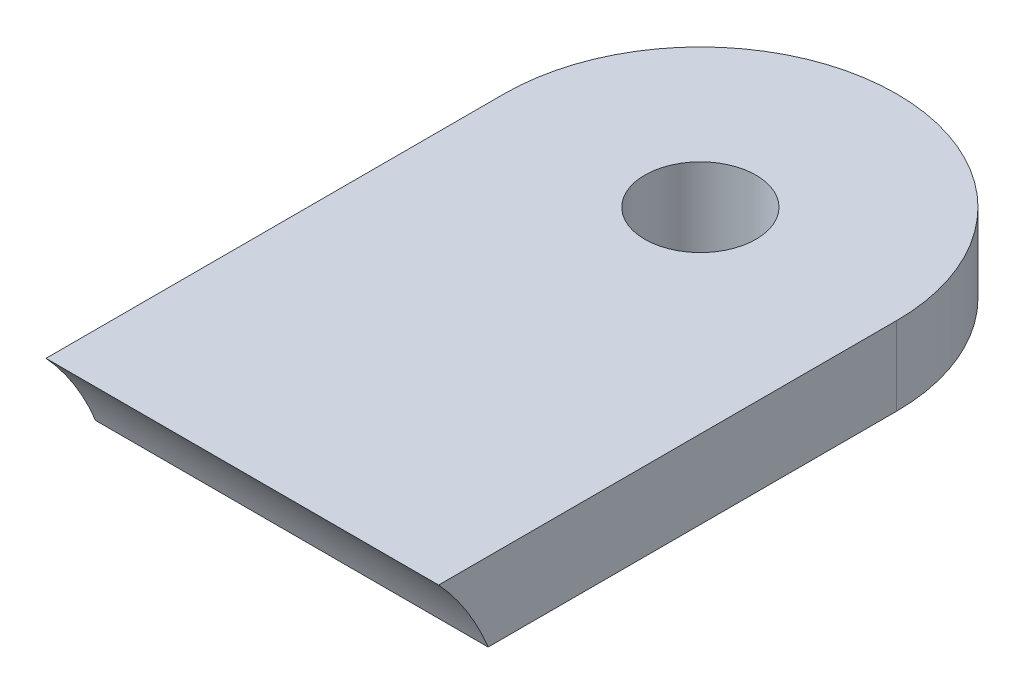
ISO-10303-21;
HEADER;
FILE_DESCRIPTION(('STEP AP214'),'2;1');
FILE_NAME('part.step','',(''),(''),'','','');
FILE_SCHEMA(('AUTOMOTIVE_DESIGN { 1 0 10303 214 1 1 1 1 }'));
ENDSEC;
DATA;
#1=APPLICATION_CONTEXT('core data for automotive mechanical design processes');
#2=APPLICATION_PROTOCOL_DEFINITION('international standard','automotive_design',2000,#1);
#3=PRODUCT_CONTEXT('',#1,'mechanical');
#4=PRODUCT('Part','Part','',(#3));
#5=PRODUCT_RELATED_PRODUCT_CATEGORY('part','',(#4));
#6=PRODUCT_DEFINITION_FORMATION('','',#4);
#7=PRODUCT_DEFINITION_CONTEXT('part definition',#1,'design');
#8=PRODUCT_DEFINITION('design','',#6,#7);
#9=PRODUCT_DEFINITION_SHAPE('','',#8);
#10=(LENGTH_UNIT() NAMED_UNIT(*) SI_UNIT(.MILLI.,.METRE.));
#11=(NAMED_UNIT(*) PLANE_ANGLE_UNIT() SI_UNIT($,.RADIAN.));
#12=(NAMED_UNIT(*) SI_UNIT($,.STERADIAN.) SOLID_ANGLE_UNIT());
#13=UNCERTAINTY_MEASURE_WITH_UNIT(LENGTH_MEASURE(1.E-05),#10,'distance_accuracy_value','');
#14=(GEOMETRIC_REPRESENTATION_CONTEXT(3) GLOBAL_UNCERTAINTY_ASSIGNED_CONTEXT((#13)) GLOBAL_UNIT_ASSIGNED_CONTEXT((#10,
#11,#12)) REPRESENTATION_CONTEXT('',''));
#15=CARTESIAN_POINT('',(0.,0.,0.));
#16=DIRECTION('',(0.,0.,1.));
#17=DIRECTION('',(1.,0.,0.));
#18=AXIS2_PLACEMENT_3D('',#15,#16,#17);
#19=CARTESIAN_POINT('',(0.,6.,0.));
#20=DIRECTION('',(0.,1.,0.));
#21=DIRECTION('',(0.,0.,1.));
#22=AXIS2_PLACEMENT_3D('',#19,#20,#21);
#23=PLANE('',#22);
#24=CARTESIAN_POINT('',(-15.,6.,-35.));
#25=DIRECTION('',(0.,1.,0.));
#26=DIRECTION('',(0.,0.,1.));
#27=AXIS2_PLACEMENT_3D('',#24,#25,#26);
#28=CIRCLE('',#27,15.);
#29=CARTESIAN_POINT('',(0.,6.,-35.));
#30=VERTEX_POINT('',#29);
#31=CARTESIAN_POINT('',(-15.,6.,-50.));
#32=VERTEX_POINT('',#31);
#33=EDGE_CURVE('E67',#30,#32,#28,.T.);
#34=ORIENTED_EDGE('',*,*,#33,.T.);
#35=CARTESIAN_POINT('',(-15.,6.,-35.));
#36=DIRECTION('',(0.,1.,0.));
#37=DIRECTION('',(0.,0.,1.));
#38=AXIS2_PLACEMENT_3D('',#35,#36,#37);
#39=CIRCLE('',#38,15.);
#40=CARTESIAN_POINT('',(-30.,6.,-35.));
#41=VERTEX_POINT('',#40);
#42=EDGE_CURVE('E60',#32,#41,#39,.T.);
#43=ORIENTED_EDGE('',*,*,#42,.T.);
#44=DIRECTION('',(0.,0.,1.));
#45=VECTOR('',#44,1.);
#46=CARTESIAN_POINT('',(-30.,6.,0.));
#47=LINE('',#46,#45);
#48=CARTESIAN_POINT('',(-30.,5.99999999999998,0.));
#49=VERTEX_POINT('',#48);
#50=EDGE_CURVE('E106',#41,#49,#47,.T.);
#51=ORIENTED_EDGE('',*,*,#50,.T.);
#52=DIRECTION('',(1.,0.,0.));
#53=VECTOR('',#52,1.);
#54=CARTESIAN_POINT('',(0.,6.,0.));
#55=LINE('',#54,#53);
#56=CARTESIAN_POINT('',(0.,6.,0.));
#57=VERTEX_POINT('',#56);
#58=EDGE_CURVE('E97',#49,#57,#55,.T.);
#59=ORIENTED_EDGE('',*,*,#58,.T.);
#60=DIRECTION('',(0.,0.,-1.));
#61=VECTOR('',#60,1.);
#62=CARTESIAN_POINT('',(0.,6.,0.));
#63=LINE('',#62,#61);
#64=EDGE_CURVE('E119',#57,#30,#63,.T.);
#65=ORIENTED_EDGE('',*,*,#64,.T.);
#66=EDGE_LOOP('',(#34,#43,#51,#59,#65));
#67=FACE_BOUND('',#66,.T.);
#68=CARTESIAN_POINT('',(-15.,6.,-35.));
#69=DIRECTION('',(0.,1.,0.));
#70=DIRECTION('',(0.,0.,1.));
#71=AXIS2_PLACEMENT_3D('',#68,#69,#70);
#72=CIRCLE('',#71,4.25);
#73=CARTESIAN_POINT('',(-15.,6.,-30.75));
#74=VERTEX_POINT('',#73);
#75=EDGE_CURVE('E126',#74,#74,#72,.T.);
#76=ORIENTED_EDGE('',*,*,#75,.F.);
#77=EDGE_LOOP('',(#76));
#78=FACE_BOUND('',#77,.T.);
#79=ADVANCED_FACE('F51',(#67,#78),#23,.T.);
#80=CARTESIAN_POINT('',(0.,0.,0.));
#81=DIRECTION('',(0.,1.,0.));
#82=DIRECTION('',(0.,0.,1.));
#83=AXIS2_PLACEMENT_3D('',#80,#81,#82);
#84=PLANE('',#83);
#85=DIRECTION('',(0.,0.,-1.));
#86=VECTOR('',#85,1.);
#87=CARTESIAN_POINT('',(0.,0.,0.));
#88=LINE('',#87,#86);
#89=CARTESIAN_POINT('',(0.,0.,-3.78414165436543));
#90=VERTEX_POINT('',#89);
#91=CARTESIAN_POINT('',(0.,0.,-35.));
#92=VERTEX_POINT('',#91);
#93=EDGE_CURVE('E124',#90,#92,#88,.T.);
#94=ORIENTED_EDGE('',*,*,#93,.F.);
#95=DIRECTION('',(-1.,0.,0.));
#96=VECTOR('',#95,1.);
#97=CARTESIAN_POINT('',(0.,0.,-3.78414165436543));
#98=LINE('',#97,#96);
#99=CARTESIAN_POINT('',(-30.,0.,-3.78414165436543));
#100=VERTEX_POINT('',#99);
#101=EDGE_CURVE('E145',#90,#100,#98,.T.);
#102=ORIENTED_EDGE('',*,*,#101,.T.);
#103=DIRECTION('',(0.,0.,1.));
#104=VECTOR('',#103,1.);
#105=CARTESIAN_POINT('',(-30.,0.,0.));
#106=LINE('',#105,#104);
#107=CARTESIAN_POINT('',(-30.,0.,-35.));
#108=VERTEX_POINT('',#107);
#109=EDGE_CURVE('E115',#108,#100,#106,.T.);
#110=ORIENTED_EDGE('',*,*,#109,.F.);
#111=CARTESIAN_POINT('',(-15.,0.,-35.));
#112=DIRECTION('',(0.,1.,0.));
#113=DIRECTION('',(0.,0.,1.));
#114=AXIS2_PLACEMENT_3D('',#111,#112,#113);
#115=CIRCLE('',#114,15.);
#116=CARTESIAN_POINT('',(-15.,0.,-50.));
#117=VERTEX_POINT('',#116);
#118=EDGE_CURVE('E132',#108,#117,#115,.F.);
#119=ORIENTED_EDGE('',*,*,#118,.T.);
#120=CARTESIAN_POINT('',(-15.,0.,-35.));
#121=DIRECTION('',(0.,1.,0.));
#122=DIRECTION('',(0.,0.,1.));
#123=AXIS2_PLACEMENT_3D('',#120,#121,#122);
#124=CIRCLE('',#123,15.);
#125=EDGE_CURVE('E129',#117,#92,#124,.F.);
#126=ORIENTED_EDGE('',*,*,#125,.T.);
#127=EDGE_LOOP('',(#94,#102,#110,#119,#126));
#128=FACE_BOUND('',#127,.T.);
#129=CARTESIAN_POINT('',(-15.,0.,-35.));
#130=DIRECTION('',(0.,1.,0.));
#131=DIRECTION('',(0.,0.,1.));
#132=AXIS2_PLACEMENT_3D('',#129,#130,#131);
#133=CIRCLE('',#132,4.25);
#134=CARTESIAN_POINT('',(-15.,0.,-30.75));
#135=VERTEX_POINT('',#134);
#136=EDGE_CURVE('E144',#135,#135,#133,.T.);
#137=ORIENTED_EDGE('',*,*,#136,.T.);
#138=EDGE_LOOP('',(#137));
#139=FACE_BOUND('',#138,.T.);
#140=ADVANCED_FACE('F138',(#128,#139),#84,.F.);
#141=CARTESIAN_POINT('',(0.,6.,0.));
#142=DIRECTION('',(-1.,0.,0.));
#143=DIRECTION('',(0.,0.,1.));
#144=AXIS2_PLACEMENT_3D('',#141,#142,#143);
#145=PLANE('',#144);
#146=ORIENTED_EDGE('',*,*,#64,.F.);
#147=CARTESIAN_POINT('',(0.,-7.5,14.7563545633737));
#148=DIRECTION('',(-1.,0.,0.));
#149=DIRECTION('',(0.,0.,1.));
#150=AXIS2_PLACEMENT_3D('',#147,#148,#149);
#151=CIRCLE('',#150,20.);
#152=EDGE_CURVE('E103',#57,#90,#151,.T.);
#153=ORIENTED_EDGE('',*,*,#152,.T.);
#154=ORIENTED_EDGE('',*,*,#93,.T.);
#155=DIRECTION('',(0.,-1.,0.));
#156=VECTOR('',#155,1.);
#157=CARTESIAN_POINT('',(0.,6.,-35.));
#158=LINE('',#157,#156);
#159=EDGE_CURVE('E11',#92,#30,#158,.F.);
#160=ORIENTED_EDGE('',*,*,#159,.T.);
#161=EDGE_LOOP('',(#146,#153,#154,#160));
#162=FACE_BOUND('',#161,.T.);
#163=ADVANCED_FACE('F160',(#162),#145,.F.);
#164=CARTESIAN_POINT('',(-30.,6.,0.));
#165=DIRECTION('',(1.,0.,0.));
#166=DIRECTION('',(0.,0.,-1.));
#167=AXIS2_PLACEMENT_3D('',#164,#165,#166);
#168=PLANE('',#167);
#169=ORIENTED_EDGE('',*,*,#109,.T.);
#170=CARTESIAN_POINT('',(-30.,-7.5,14.7563545633737));
#171=DIRECTION('',(-1.,0.,0.));
#172=DIRECTION('',(0.,0.,1.));
#173=AXIS2_PLACEMENT_3D('',#170,#171,#172);
#174=CIRCLE('',#173,20.);
#175=EDGE_CURVE('E100',#49,#100,#174,.T.);
#176=ORIENTED_EDGE('',*,*,#175,.F.);
#177=ORIENTED_EDGE('',*,*,#50,.F.);
#178=DIRECTION('',(0.,-1.,0.));
#179=VECTOR('',#178,1.);
#180=CARTESIAN_POINT('',(-30.,6.,-35.));
#181=LINE('',#180,#179);
#182=EDGE_CURVE('E105',#41,#108,#181,.T.);
#183=ORIENTED_EDGE('',*,*,#182,.T.);
#184=EDGE_LOOP('',(#169,#176,#177,#183));
#185=FACE_BOUND('',#184,.T.);
#186=ADVANCED_FACE('F111',(#185),#168,.F.);
#187=CARTESIAN_POINT('',(-15.,6.,-35.));
#188=DIRECTION('',(0.,-1.,0.));
#189=DIRECTION('',(0.,0.,-1.));
#190=AXIS2_PLACEMENT_3D('',#187,#188,#189);
#191=CYLINDRICAL_SURFACE('',#190,4.25);
#192=ORIENTED_EDGE('',*,*,#75,.T.);
#193=EDGE_LOOP('',(#192));
#194=FACE_BOUND('',#193,.T.);
#195=ORIENTED_EDGE('',*,*,#136,.F.);
#196=EDGE_LOOP('',(#195));
#197=FACE_BOUND('',#196,.T.);
#198=ADVANCED_FACE('F153',(#194,#197),#191,.F.);
#199=CARTESIAN_POINT('',(-15.,6.,-35.));
#200=DIRECTION('',(0.,-1.,0.));
#201=DIRECTION('',(0.,0.,-1.));
#202=AXIS2_PLACEMENT_3D('',#199,#200,#201);
#203=CYLINDRICAL_SURFACE('',#202,15.);
#204=DIRECTION('',(0.,-1.,0.));
#205=VECTOR('',#204,1.);
#206=CARTESIAN_POINT('',(-15.,6.,-50.));
#207=LINE('',#206,#205);
#208=EDGE_CURVE('E55',#32,#117,#207,.T.);
#209=ORIENTED_EDGE('',*,*,#208,.F.);
#210=ORIENTED_EDGE('',*,*,#33,.F.);
#211=ORIENTED_EDGE('',*,*,#159,.F.);
#212=ORIENTED_EDGE('',*,*,#125,.F.);
#213=EDGE_LOOP('',(#209,#210,#211,#212));
#214=FACE_BOUND('',#213,.T.);
#215=ADVANCED_FACE('F53',(#214),#203,.T.);
#216=CARTESIAN_POINT('',(-15.,6.,-35.));
#217=DIRECTION('',(0.,-1.,0.));
#218=DIRECTION('',(0.,0.,-1.));
#219=AXIS2_PLACEMENT_3D('',#216,#217,#218);
#220=CYLINDRICAL_SURFACE('',#219,15.);
#221=ORIENTED_EDGE('',*,*,#42,.F.);
#222=ORIENTED_EDGE('',*,*,#208,.T.);
#223=ORIENTED_EDGE('',*,*,#118,.F.);
#224=ORIENTED_EDGE('',*,*,#182,.F.);
#225=EDGE_LOOP('',(#221,#222,#223,#224));
#226=FACE_BOUND('',#225,.T.);
#227=ADVANCED_FACE('F143',(#226),#220,.T.);
#228=CARTESIAN_POINT('',(0.,-7.5,14.7563545633737));
#229=DIRECTION('',(-1.,0.,0.));
#230=DIRECTION('',(0.,0.,1.));
#231=AXIS2_PLACEMENT_3D('',#228,#229,#230);
#232=CYLINDRICAL_SURFACE('',#231,20.);
#233=ORIENTED_EDGE('',*,*,#152,.F.);
#234=ORIENTED_EDGE('',*,*,#58,.F.);
#235=ORIENTED_EDGE('',*,*,#175,.T.);
#236=ORIENTED_EDGE('',*,*,#101,.F.);
#237=EDGE_LOOP('',(#233,#234,#235,#236));
#238=FACE_BOUND('',#237,.T.);
#239=ADVANCED_FACE('F99',(#238),#232,.F.);
#240=CLOSED_SHELL('',(#79,#140,#163,#186,#198,#215,#227,#239));
#241=MANIFOLD_SOLID_BREP('B2',#240);
#242=ADVANCED_BREP_SHAPE_REPRESENTATION('',(#18,#241),#14);
#243=SHAPE_DEFINITION_REPRESENTATION(#9,#242);
ENDSEC;
END-ISO-10303-21;
